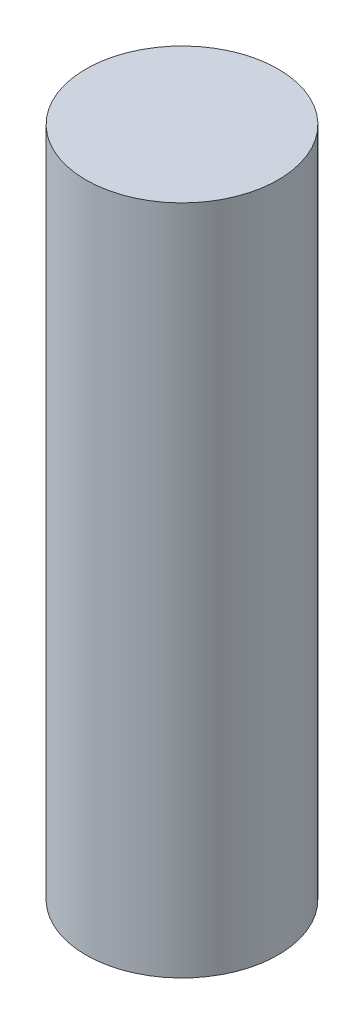
ISO-10303-21;
HEADER;
FILE_DESCRIPTION(('STEP AP214'),'2;1');
FILE_NAME('part.step','',(''),(''),'','','');
FILE_SCHEMA(('AUTOMOTIVE_DESIGN { 1 0 10303 214 1 1 1 1 }'));
ENDSEC;
DATA;
#1=APPLICATION_CONTEXT('core data for automotive mechanical design processes');
#2=APPLICATION_PROTOCOL_DEFINITION('international standard','automotive_design',2000,#1);
#3=PRODUCT_CONTEXT('',#1,'mechanical');
#4=PRODUCT('Part','Part','',(#3));
#5=PRODUCT_RELATED_PRODUCT_CATEGORY('part','',(#4));
#6=PRODUCT_DEFINITION_FORMATION('','',#4);
#7=PRODUCT_DEFINITION_CONTEXT('part definition',#1,'design');
#8=PRODUCT_DEFINITION('design','',#6,#7);
#9=PRODUCT_DEFINITION_SHAPE('','',#8);
#10=(LENGTH_UNIT() NAMED_UNIT(*) SI_UNIT(.MILLI.,.METRE.));
#11=(NAMED_UNIT(*) PLANE_ANGLE_UNIT() SI_UNIT($,.RADIAN.));
#12=(NAMED_UNIT(*) SI_UNIT($,.STERADIAN.) SOLID_ANGLE_UNIT());
#13=UNCERTAINTY_MEASURE_WITH_UNIT(LENGTH_MEASURE(1.E-05),#10,'distance_accuracy_value','');
#14=(GEOMETRIC_REPRESENTATION_CONTEXT(3) GLOBAL_UNCERTAINTY_ASSIGNED_CONTEXT((#13)) GLOBAL_UNIT_ASSIGNED_CONTEXT((#10,
#11,#12)) REPRESENTATION_CONTEXT('',''));
#15=CARTESIAN_POINT('',(0.,0.,0.));
#16=DIRECTION('',(0.,0.,1.));
#17=DIRECTION('',(1.,0.,0.));
#18=AXIS2_PLACEMENT_3D('',#15,#16,#17);
#19=CARTESIAN_POINT('',(0.,22.,0.));
#20=DIRECTION('',(0.,-1.,0.));
#21=DIRECTION('',(0.,0.,-1.));
#22=AXIS2_PLACEMENT_3D('',#19,#20,#21);
#23=CYLINDRICAL_SURFACE('',#22,3.15);
#24=CARTESIAN_POINT('',(0.,22.,0.));
#25=DIRECTION('',(0.,1.,0.));
#26=DIRECTION('',(0.,0.,1.));
#27=AXIS2_PLACEMENT_3D('',#24,#25,#26);
#28=CIRCLE('',#27,3.15);
#29=CARTESIAN_POINT('',(0.,22.,3.15));
#30=VERTEX_POINT('',#29);
#31=EDGE_CURVE('E10',#30,#30,#28,.T.);
#32=ORIENTED_EDGE('',*,*,#31,.F.);
#33=EDGE_LOOP('',(#32));
#34=FACE_BOUND('',#33,.T.);
#35=CARTESIAN_POINT('',(0.,0.,0.));
#36=DIRECTION('',(0.,1.,0.));
#37=DIRECTION('',(0.,0.,1.));
#38=AXIS2_PLACEMENT_3D('',#35,#36,#37);
#39=CIRCLE('',#38,3.15);
#40=CARTESIAN_POINT('',(0.,0.,3.15));
#41=VERTEX_POINT('',#40);
#42=EDGE_CURVE('E37',#41,#41,#39,.T.);
#43=ORIENTED_EDGE('',*,*,#42,.T.);
#44=EDGE_LOOP('',(#43));
#45=FACE_BOUND('',#44,.T.);
#46=ADVANCED_FACE('F34',(#34,#45),#23,.T.);
#47=CARTESIAN_POINT('',(0.,22.,0.));
#48=DIRECTION('',(0.,1.,0.));
#49=DIRECTION('',(0.,0.,1.));
#50=AXIS2_PLACEMENT_3D('',#47,#48,#49);
#51=PLANE('',#50);
#52=ORIENTED_EDGE('',*,*,#31,.T.);
#53=EDGE_LOOP('',(#52));
#54=FACE_BOUND('',#53,.T.);
#55=ADVANCED_FACE('F49',(#54),#51,.T.);
#56=CARTESIAN_POINT('',(0.,0.,0.));
#57=DIRECTION('',(0.,1.,0.));
#58=DIRECTION('',(0.,0.,1.));
#59=AXIS2_PLACEMENT_3D('',#56,#57,#58);
#60=PLANE('',#59);
#61=ORIENTED_EDGE('',*,*,#42,.F.);
#62=EDGE_LOOP('',(#61));
#63=FACE_BOUND('',#62,.T.);
#64=ADVANCED_FACE('F47',(#63),#60,.F.);
#65=CLOSED_SHELL('',(#46,#55,#64));
#66=MANIFOLD_SOLID_BREP('B2',#65);
#67=ADVANCED_BREP_SHAPE_REPRESENTATION('',(#18,#66),#14);
#68=SHAPE_DEFINITION_REPRESENTATION(#9,#67);
ENDSEC;
END-ISO-10303-21;
